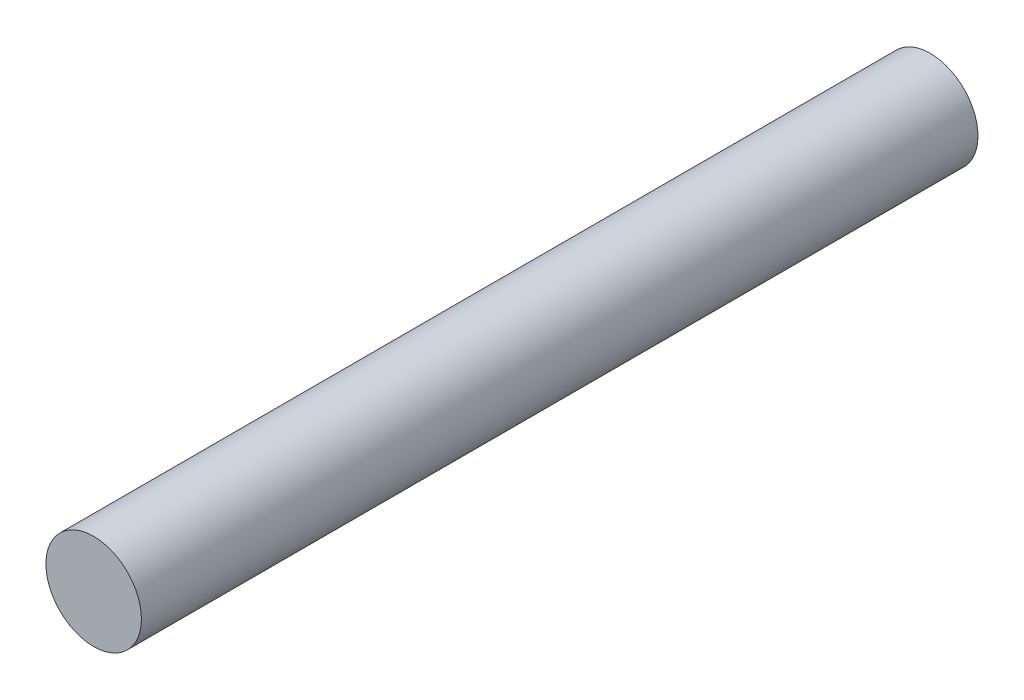
ISO-10303-21;
HEADER;
FILE_DESCRIPTION(('STEP AP214'),'2;1');
FILE_NAME('part.step','',(''),(''),'','','');
FILE_SCHEMA(('AUTOMOTIVE_DESIGN { 1 0 10303 214 1 1 1 1 }'));
ENDSEC;
DATA;
#1=APPLICATION_CONTEXT('core data for automotive mechanical design processes');
#2=APPLICATION_PROTOCOL_DEFINITION('international standard','automotive_design',2000,#1);
#3=PRODUCT_CONTEXT('',#1,'mechanical');
#4=PRODUCT('Part','Part','',(#3));
#5=PRODUCT_RELATED_PRODUCT_CATEGORY('part','',(#4));
#6=PRODUCT_DEFINITION_FORMATION('','',#4);
#7=PRODUCT_DEFINITION_CONTEXT('part definition',#1,'design');
#8=PRODUCT_DEFINITION('design','',#6,#7);
#9=PRODUCT_DEFINITION_SHAPE('','',#8);
#10=(LENGTH_UNIT() NAMED_UNIT(*) SI_UNIT(.MILLI.,.METRE.));
#11=(NAMED_UNIT(*) PLANE_ANGLE_UNIT() SI_UNIT($,.RADIAN.));
#12=(NAMED_UNIT(*) SI_UNIT($,.STERADIAN.) SOLID_ANGLE_UNIT());
#13=UNCERTAINTY_MEASURE_WITH_UNIT(LENGTH_MEASURE(1.E-05),#10,'distance_accuracy_value','');
#14=(GEOMETRIC_REPRESENTATION_CONTEXT(3) GLOBAL_UNCERTAINTY_ASSIGNED_CONTEXT((#13)) GLOBAL_UNIT_ASSIGNED_CONTEXT((#10,
#11,#12)) REPRESENTATION_CONTEXT('',''));
#15=CARTESIAN_POINT('',(0.,0.,0.));
#16=DIRECTION('',(0.,0.,1.));
#17=DIRECTION('',(1.,0.,0.));
#18=AXIS2_PLACEMENT_3D('',#15,#16,#17);
#19=CARTESIAN_POINT('',(0.,0.,43.8));
#20=DIRECTION('',(0.,0.,-1.));
#21=DIRECTION('',(-1.,0.,0.));
#22=AXIS2_PLACEMENT_3D('',#19,#20,#21);
#23=CYLINDRICAL_SURFACE('',#22,2.5);
#24=CARTESIAN_POINT('',(0.,0.,43.8));
#25=DIRECTION('',(0.,0.,1.));
#26=DIRECTION('',(1.,0.,0.));
#27=AXIS2_PLACEMENT_3D('',#24,#25,#26);
#28=CIRCLE('',#27,2.5);
#29=CARTESIAN_POINT('',(2.5,0.,43.8));
#30=VERTEX_POINT('',#29);
#31=EDGE_CURVE('E10',#30,#30,#28,.T.);
#32=ORIENTED_EDGE('',*,*,#31,.F.);
#33=EDGE_LOOP('',(#32));
#34=FACE_BOUND('',#33,.T.);
#35=CARTESIAN_POINT('',(0.,0.,0.));
#36=DIRECTION('',(0.,0.,1.));
#37=DIRECTION('',(1.,0.,0.));
#38=AXIS2_PLACEMENT_3D('',#35,#36,#37);
#39=CIRCLE('',#38,2.5);
#40=CARTESIAN_POINT('',(2.5,0.,0.));
#41=VERTEX_POINT('',#40);
#42=EDGE_CURVE('E38',#41,#41,#39,.T.);
#43=ORIENTED_EDGE('',*,*,#42,.T.);
#44=EDGE_LOOP('',(#43));
#45=FACE_BOUND('',#44,.T.);
#46=ADVANCED_FACE('F35',(#34,#45),#23,.T.);
#47=CARTESIAN_POINT('',(0.,0.,43.8));
#48=DIRECTION('',(0.,0.,1.));
#49=DIRECTION('',(1.,0.,0.));
#50=AXIS2_PLACEMENT_3D('',#47,#48,#49);
#51=PLANE('',#50);
#52=ORIENTED_EDGE('',*,*,#31,.T.);
#53=EDGE_LOOP('',(#52));
#54=FACE_BOUND('',#53,.T.);
#55=ADVANCED_FACE('F50',(#54),#51,.T.);
#56=CARTESIAN_POINT('',(0.,0.,0.));
#57=DIRECTION('',(0.,0.,1.));
#58=DIRECTION('',(1.,0.,0.));
#59=AXIS2_PLACEMENT_3D('',#56,#57,#58);
#60=PLANE('',#59);
#61=ORIENTED_EDGE('',*,*,#42,.F.);
#62=EDGE_LOOP('',(#61));
#63=FACE_BOUND('',#62,.T.);
#64=ADVANCED_FACE('F48',(#63),#60,.F.);
#65=CLOSED_SHELL('',(#46,#55,#64));
#66=MANIFOLD_SOLID_BREP('B2',#65);
#67=ADVANCED_BREP_SHAPE_REPRESENTATION('',(#18,#66),#14);
#68=SHAPE_DEFINITION_REPRESENTATION(#9,#67);
ENDSEC;
END-ISO-10303-21;
